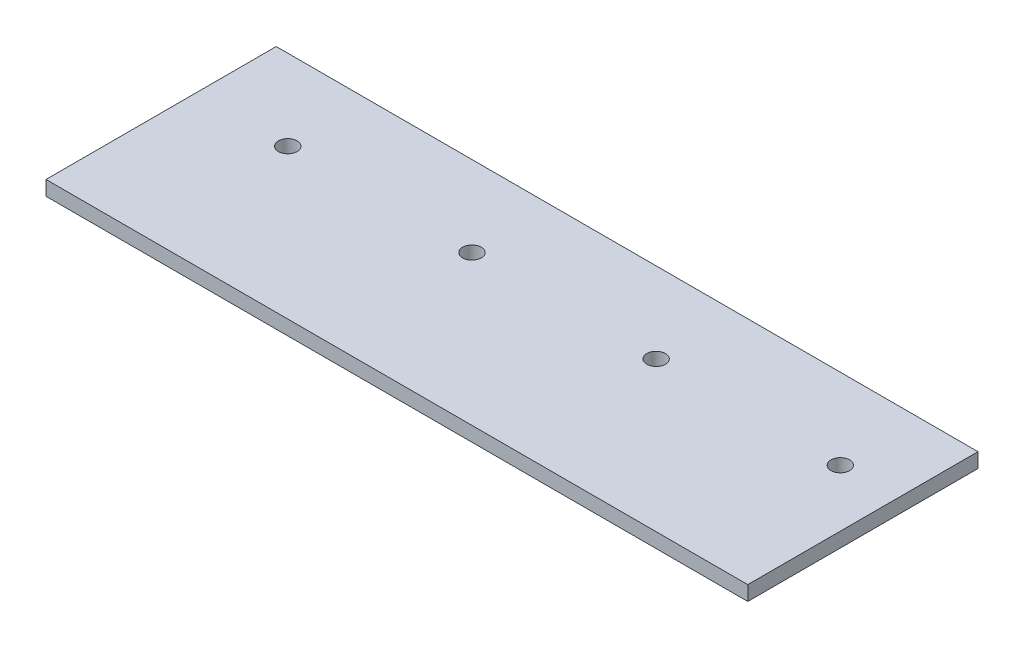
ISO-10303-21;
HEADER;
FILE_DESCRIPTION(('STEP AP214'),'2;1');
FILE_NAME('part.step','',(''),(''),'','','');
FILE_SCHEMA(('AUTOMOTIVE_DESIGN { 1 0 10303 214 1 1 1 1 }'));
ENDSEC;
DATA;
#1=APPLICATION_CONTEXT('core data for automotive mechanical design processes');
#2=APPLICATION_PROTOCOL_DEFINITION('international standard','automotive_design',2000,#1);
#3=PRODUCT_CONTEXT('',#1,'mechanical');
#4=PRODUCT('Part','Part','',(#3));
#5=PRODUCT_RELATED_PRODUCT_CATEGORY('part','',(#4));
#6=PRODUCT_DEFINITION_FORMATION('','',#4);
#7=PRODUCT_DEFINITION_CONTEXT('part definition',#1,'design');
#8=PRODUCT_DEFINITION('design','',#6,#7);
#9=PRODUCT_DEFINITION_SHAPE('','',#8);
#10=(LENGTH_UNIT() NAMED_UNIT(*) SI_UNIT(.MILLI.,.METRE.));
#11=(NAMED_UNIT(*) PLANE_ANGLE_UNIT() SI_UNIT($,.RADIAN.));
#12=(NAMED_UNIT(*) SI_UNIT($,.STERADIAN.) SOLID_ANGLE_UNIT());
#13=UNCERTAINTY_MEASURE_WITH_UNIT(LENGTH_MEASURE(1.E-05),#10,'distance_accuracy_value','');
#14=(GEOMETRIC_REPRESENTATION_CONTEXT(3) GLOBAL_UNCERTAINTY_ASSIGNED_CONTEXT((#13)) GLOBAL_UNIT_ASSIGNED_CONTEXT((#10,
#11,#12)) REPRESENTATION_CONTEXT('',''));
#15=CARTESIAN_POINT('',(0.,0.,0.));
#16=DIRECTION('',(0.,0.,1.));
#17=DIRECTION('',(1.,0.,0.));
#18=AXIS2_PLACEMENT_3D('',#15,#16,#17);
#19=CARTESIAN_POINT('',(0.,-6.35,-100.));
#20=DIRECTION('',(-1.,0.,0.));
#21=DIRECTION('',(0.,0.,1.));
#22=AXIS2_PLACEMENT_3D('',#19,#20,#21);
#23=PLANE('',#22);
#24=DIRECTION('',(0.,0.,1.));
#25=VECTOR('',#24,1.);
#26=CARTESIAN_POINT('',(0.,0.,-100.));
#27=LINE('',#26,#25);
#28=CARTESIAN_POINT('',(0.,0.,-100.));
#29=VERTEX_POINT('',#28);
#30=CARTESIAN_POINT('',(0.,0.,0.));
#31=VERTEX_POINT('',#30);
#32=EDGE_CURVE('E98',#29,#31,#27,.T.);
#33=ORIENTED_EDGE('',*,*,#32,.F.);
#34=DIRECTION('',(0.,1.,0.));
#35=VECTOR('',#34,1.);
#36=CARTESIAN_POINT('',(0.,-6.35,-100.));
#37=LINE('',#36,#35);
#38=CARTESIAN_POINT('',(0.,-6.35,-100.));
#39=VERTEX_POINT('',#38);
#40=EDGE_CURVE('E11',#39,#29,#37,.T.);
#41=ORIENTED_EDGE('',*,*,#40,.F.);
#42=DIRECTION('',(0.,0.,1.));
#43=VECTOR('',#42,1.);
#44=CARTESIAN_POINT('',(0.,-6.35,-100.));
#45=LINE('',#44,#43);
#46=CARTESIAN_POINT('',(0.,-6.35,0.));
#47=VERTEX_POINT('',#46);
#48=EDGE_CURVE('E91',#39,#47,#45,.T.);
#49=ORIENTED_EDGE('',*,*,#48,.T.);
#50=DIRECTION('',(0.,1.,0.));
#51=VECTOR('',#50,1.);
#52=CARTESIAN_POINT('',(0.,-6.35,0.));
#53=LINE('',#52,#51);
#54=EDGE_CURVE('E36',#47,#31,#53,.T.);
#55=ORIENTED_EDGE('',*,*,#54,.T.);
#56=EDGE_LOOP('',(#33,#41,#49,#55));
#57=FACE_BOUND('',#56,.T.);
#58=ADVANCED_FACE('F33',(#57),#23,.T.);
#59=CARTESIAN_POINT('',(0.,-6.35,-100.));
#60=DIRECTION('',(0.,0.,-1.));
#61=DIRECTION('',(-1.,0.,0.));
#62=AXIS2_PLACEMENT_3D('',#59,#60,#61);
#63=PLANE('',#62);
#64=DIRECTION('',(-1.,0.,0.));
#65=VECTOR('',#64,1.);
#66=CARTESIAN_POINT('',(0.,0.,-100.));
#67=LINE('',#66,#65);
#68=CARTESIAN_POINT('',(304.8,0.,-100.));
#69=VERTEX_POINT('',#68);
#70=EDGE_CURVE('E93',#69,#29,#67,.T.);
#71=ORIENTED_EDGE('',*,*,#70,.F.);
#72=DIRECTION('',(0.,1.,0.));
#73=VECTOR('',#72,1.);
#74=CARTESIAN_POINT('',(304.8,-6.35,-100.));
#75=LINE('',#74,#73);
#76=CARTESIAN_POINT('',(304.8,-6.35,-100.));
#77=VERTEX_POINT('',#76);
#78=EDGE_CURVE('E42',#77,#69,#75,.T.);
#79=ORIENTED_EDGE('',*,*,#78,.F.);
#80=DIRECTION('',(-1.,0.,0.));
#81=VECTOR('',#80,1.);
#82=CARTESIAN_POINT('',(0.,-6.35,-100.));
#83=LINE('',#82,#81);
#84=EDGE_CURVE('E88',#77,#39,#83,.T.);
#85=ORIENTED_EDGE('',*,*,#84,.T.);
#86=ORIENTED_EDGE('',*,*,#40,.T.);
#87=EDGE_LOOP('',(#71,#79,#85,#86));
#88=FACE_BOUND('',#87,.T.);
#89=ADVANCED_FACE('F109',(#88),#63,.T.);
#90=CARTESIAN_POINT('',(304.8,-6.35,-100.));
#91=DIRECTION('',(1.,0.,0.));
#92=DIRECTION('',(0.,0.,-1.));
#93=AXIS2_PLACEMENT_3D('',#90,#91,#92);
#94=PLANE('',#93);
#95=DIRECTION('',(0.,0.,-1.));
#96=VECTOR('',#95,1.);
#97=CARTESIAN_POINT('',(304.8,0.,-100.));
#98=LINE('',#97,#96);
#99=CARTESIAN_POINT('',(304.8,0.,0.));
#100=VERTEX_POINT('',#99);
#101=EDGE_CURVE('E83',#100,#69,#98,.T.);
#102=ORIENTED_EDGE('',*,*,#101,.F.);
#103=DIRECTION('',(0.,1.,0.));
#104=VECTOR('',#103,1.);
#105=CARTESIAN_POINT('',(304.8,-6.35,0.));
#106=LINE('',#105,#104);
#107=CARTESIAN_POINT('',(304.8,-6.35,0.));
#108=VERTEX_POINT('',#107);
#109=EDGE_CURVE('E78',#108,#100,#106,.T.);
#110=ORIENTED_EDGE('',*,*,#109,.F.);
#111=DIRECTION('',(0.,0.,-1.));
#112=VECTOR('',#111,1.);
#113=CARTESIAN_POINT('',(304.8,-6.35,-100.));
#114=LINE('',#113,#112);
#115=EDGE_CURVE('E81',#108,#77,#114,.T.);
#116=ORIENTED_EDGE('',*,*,#115,.T.);
#117=ORIENTED_EDGE('',*,*,#78,.T.);
#118=EDGE_LOOP('',(#102,#110,#116,#117));
#119=FACE_BOUND('',#118,.T.);
#120=ADVANCED_FACE('F80',(#119),#94,.T.);
#121=CARTESIAN_POINT('',(0.,-6.35,0.));
#122=DIRECTION('',(0.,0.,1.));
#123=DIRECTION('',(1.,0.,0.));
#124=AXIS2_PLACEMENT_3D('',#121,#122,#123);
#125=PLANE('',#124);
#126=DIRECTION('',(1.,0.,0.));
#127=VECTOR('',#126,1.);
#128=CARTESIAN_POINT('',(0.,0.,0.));
#129=LINE('',#128,#127);
#130=EDGE_CURVE('E101',#31,#100,#129,.T.);
#131=ORIENTED_EDGE('',*,*,#130,.F.);
#132=ORIENTED_EDGE('',*,*,#54,.F.);
#133=DIRECTION('',(1.,0.,0.));
#134=VECTOR('',#133,1.);
#135=CARTESIAN_POINT('',(0.,-6.35,0.));
#136=LINE('',#135,#134);
#137=EDGE_CURVE('E87',#47,#108,#136,.T.);
#138=ORIENTED_EDGE('',*,*,#137,.T.);
#139=ORIENTED_EDGE('',*,*,#109,.T.);
#140=EDGE_LOOP('',(#131,#132,#138,#139));
#141=FACE_BOUND('',#140,.T.);
#142=ADVANCED_FACE('F90',(#141),#125,.T.);
#143=CARTESIAN_POINT('',(0.,-6.35,0.));
#144=DIRECTION('',(0.,1.,0.));
#145=DIRECTION('',(0.,0.,1.));
#146=AXIS2_PLACEMENT_3D('',#143,#144,#145);
#147=PLANE('',#146);
#148=CARTESIAN_POINT('',(280.,-6.35,-65.));
#149=DIRECTION('',(0.,1.,0.));
#150=DIRECTION('',(0.,0.,1.));
#151=AXIS2_PLACEMENT_3D('',#148,#149,#150);
#152=CIRCLE('',#151,4.04999999999996);
#153=CARTESIAN_POINT('',(280.,-6.35,-60.95));
#154=VERTEX_POINT('',#153);
#155=EDGE_CURVE('E150',#154,#154,#152,.T.);
#156=ORIENTED_EDGE('',*,*,#155,.T.);
#157=EDGE_LOOP('',(#156));
#158=FACE_BOUND('',#157,.T.);
#159=CARTESIAN_POINT('',(200.,-6.35,-65.));
#160=DIRECTION('',(0.,1.,0.));
#161=DIRECTION('',(0.,0.,1.));
#162=AXIS2_PLACEMENT_3D('',#159,#160,#161);
#163=CIRCLE('',#162,4.04999999999999);
#164=CARTESIAN_POINT('',(200.,-6.35,-60.95));
#165=VERTEX_POINT('',#164);
#166=EDGE_CURVE('E158',#165,#165,#163,.T.);
#167=ORIENTED_EDGE('',*,*,#166,.T.);
#168=EDGE_LOOP('',(#167));
#169=FACE_BOUND('',#168,.T.);
#170=CARTESIAN_POINT('',(120.,-6.35,-65.));
#171=DIRECTION('',(0.,1.,0.));
#172=DIRECTION('',(0.,0.,1.));
#173=AXIS2_PLACEMENT_3D('',#170,#171,#172);
#174=CIRCLE('',#173,4.05);
#175=CARTESIAN_POINT('',(120.,-6.35,-60.95));
#176=VERTEX_POINT('',#175);
#177=EDGE_CURVE('E164',#176,#176,#174,.T.);
#178=ORIENTED_EDGE('',*,*,#177,.T.);
#179=EDGE_LOOP('',(#178));
#180=FACE_BOUND('',#179,.T.);
#181=CARTESIAN_POINT('',(40.,-6.35,-65.));
#182=DIRECTION('',(0.,1.,0.));
#183=DIRECTION('',(0.,0.,1.));
#184=AXIS2_PLACEMENT_3D('',#181,#182,#183);
#185=CIRCLE('',#184,4.05);
#186=CARTESIAN_POINT('',(40.,-6.35,-60.95));
#187=VERTEX_POINT('',#186);
#188=EDGE_CURVE('E102',#187,#187,#185,.T.);
#189=ORIENTED_EDGE('',*,*,#188,.T.);
#190=EDGE_LOOP('',(#189));
#191=FACE_BOUND('',#190,.T.);
#192=ORIENTED_EDGE('',*,*,#48,.F.);
#193=ORIENTED_EDGE('',*,*,#84,.F.);
#194=ORIENTED_EDGE('',*,*,#115,.F.);
#195=ORIENTED_EDGE('',*,*,#137,.F.);
#196=EDGE_LOOP('',(#192,#193,#194,#195));
#197=FACE_BOUND('',#196,.T.);
#198=ADVANCED_FACE('F86',(#158,#169,#180,#191,#197),#147,.F.);
#199=CARTESIAN_POINT('',(0.,0.,0.));
#200=DIRECTION('',(0.,1.,0.));
#201=DIRECTION('',(0.,0.,1.));
#202=AXIS2_PLACEMENT_3D('',#199,#200,#201);
#203=PLANE('',#202);
#204=CARTESIAN_POINT('',(280.,0.,-65.));
#205=DIRECTION('',(0.,1.,0.));
#206=DIRECTION('',(0.,0.,1.));
#207=AXIS2_PLACEMENT_3D('',#204,#205,#206);
#208=CIRCLE('',#207,4.04999999999996);
#209=CARTESIAN_POINT('',(280.,0.,-60.95));
#210=VERTEX_POINT('',#209);
#211=EDGE_CURVE('E153',#210,#210,#208,.T.);
#212=ORIENTED_EDGE('',*,*,#211,.F.);
#213=EDGE_LOOP('',(#212));
#214=FACE_BOUND('',#213,.T.);
#215=CARTESIAN_POINT('',(200.,0.,-65.));
#216=DIRECTION('',(0.,1.,0.));
#217=DIRECTION('',(0.,0.,1.));
#218=AXIS2_PLACEMENT_3D('',#215,#216,#217);
#219=CIRCLE('',#218,4.04999999999999);
#220=CARTESIAN_POINT('',(200.,0.,-60.95));
#221=VERTEX_POINT('',#220);
#222=EDGE_CURVE('E155',#221,#221,#219,.T.);
#223=ORIENTED_EDGE('',*,*,#222,.F.);
#224=EDGE_LOOP('',(#223));
#225=FACE_BOUND('',#224,.T.);
#226=CARTESIAN_POINT('',(120.,0.,-65.));
#227=DIRECTION('',(0.,1.,0.));
#228=DIRECTION('',(0.,0.,1.));
#229=AXIS2_PLACEMENT_3D('',#226,#227,#228);
#230=CIRCLE('',#229,4.05);
#231=CARTESIAN_POINT('',(120.,0.,-60.95));
#232=VERTEX_POINT('',#231);
#233=EDGE_CURVE('E161',#232,#232,#230,.T.);
#234=ORIENTED_EDGE('',*,*,#233,.F.);
#235=EDGE_LOOP('',(#234));
#236=FACE_BOUND('',#235,.T.);
#237=CARTESIAN_POINT('',(40.,0.,-65.));
#238=DIRECTION('',(0.,1.,0.));
#239=DIRECTION('',(0.,0.,1.));
#240=AXIS2_PLACEMENT_3D('',#237,#238,#239);
#241=CIRCLE('',#240,4.05);
#242=CARTESIAN_POINT('',(40.,0.,-60.95));
#243=VERTEX_POINT('',#242);
#244=EDGE_CURVE('E167',#243,#243,#241,.T.);
#245=ORIENTED_EDGE('',*,*,#244,.F.);
#246=EDGE_LOOP('',(#245));
#247=FACE_BOUND('',#246,.T.);
#248=ORIENTED_EDGE('',*,*,#32,.T.);
#249=ORIENTED_EDGE('',*,*,#130,.T.);
#250=ORIENTED_EDGE('',*,*,#101,.T.);
#251=ORIENTED_EDGE('',*,*,#70,.T.);
#252=EDGE_LOOP('',(#248,#249,#250,#251));
#253=FACE_BOUND('',#252,.T.);
#254=ADVANCED_FACE('F108',(#214,#225,#236,#247,#253),#203,.T.);
#255=CARTESIAN_POINT('',(40.,-6.35,-65.));
#256=DIRECTION('',(0.,1.,0.));
#257=DIRECTION('',(0.,0.,1.));
#258=AXIS2_PLACEMENT_3D('',#255,#256,#257);
#259=CYLINDRICAL_SURFACE('',#258,4.05);
#260=ORIENTED_EDGE('',*,*,#188,.F.);
#261=EDGE_LOOP('',(#260));
#262=FACE_BOUND('',#261,.T.);
#263=ORIENTED_EDGE('',*,*,#244,.T.);
#264=EDGE_LOOP('',(#263));
#265=FACE_BOUND('',#264,.T.);
#266=ADVANCED_FACE('F127',(#262,#265),#259,.F.);
#267=CARTESIAN_POINT('',(120.,-6.35,-65.));
#268=DIRECTION('',(0.,1.,0.));
#269=DIRECTION('',(0.,0.,1.));
#270=AXIS2_PLACEMENT_3D('',#267,#268,#269);
#271=CYLINDRICAL_SURFACE('',#270,4.05);
#272=ORIENTED_EDGE('',*,*,#177,.F.);
#273=EDGE_LOOP('',(#272));
#274=FACE_BOUND('',#273,.T.);
#275=ORIENTED_EDGE('',*,*,#233,.T.);
#276=EDGE_LOOP('',(#275));
#277=FACE_BOUND('',#276,.T.);
#278=ADVANCED_FACE('F134',(#274,#277),#271,.F.);
#279=CARTESIAN_POINT('',(200.,-6.35,-65.));
#280=DIRECTION('',(0.,1.,0.));
#281=DIRECTION('',(0.,0.,1.));
#282=AXIS2_PLACEMENT_3D('',#279,#280,#281);
#283=CYLINDRICAL_SURFACE('',#282,4.04999999999999);
#284=ORIENTED_EDGE('',*,*,#166,.F.);
#285=EDGE_LOOP('',(#284));
#286=FACE_BOUND('',#285,.T.);
#287=ORIENTED_EDGE('',*,*,#222,.T.);
#288=EDGE_LOOP('',(#287));
#289=FACE_BOUND('',#288,.T.);
#290=ADVANCED_FACE('F138',(#286,#289),#283,.F.);
#291=CARTESIAN_POINT('',(280.,-6.35,-65.));
#292=DIRECTION('',(0.,1.,0.));
#293=DIRECTION('',(0.,0.,1.));
#294=AXIS2_PLACEMENT_3D('',#291,#292,#293);
#295=CYLINDRICAL_SURFACE('',#294,4.04999999999996);
#296=ORIENTED_EDGE('',*,*,#155,.F.);
#297=EDGE_LOOP('',(#296));
#298=FACE_BOUND('',#297,.T.);
#299=ORIENTED_EDGE('',*,*,#211,.T.);
#300=EDGE_LOOP('',(#299));
#301=FACE_BOUND('',#300,.T.);
#302=ADVANCED_FACE('F142',(#298,#301),#295,.F.);
#303=CLOSED_SHELL('',(#58,#89,#120,#142,#198,#254,#266,#278,#290,#302));
#304=MANIFOLD_SOLID_BREP('B2',#303);
#305=ADVANCED_BREP_SHAPE_REPRESENTATION('',(#18,#304),#14);
#306=SHAPE_DEFINITION_REPRESENTATION(#9,#305);
ENDSEC;
END-ISO-10303-21;
